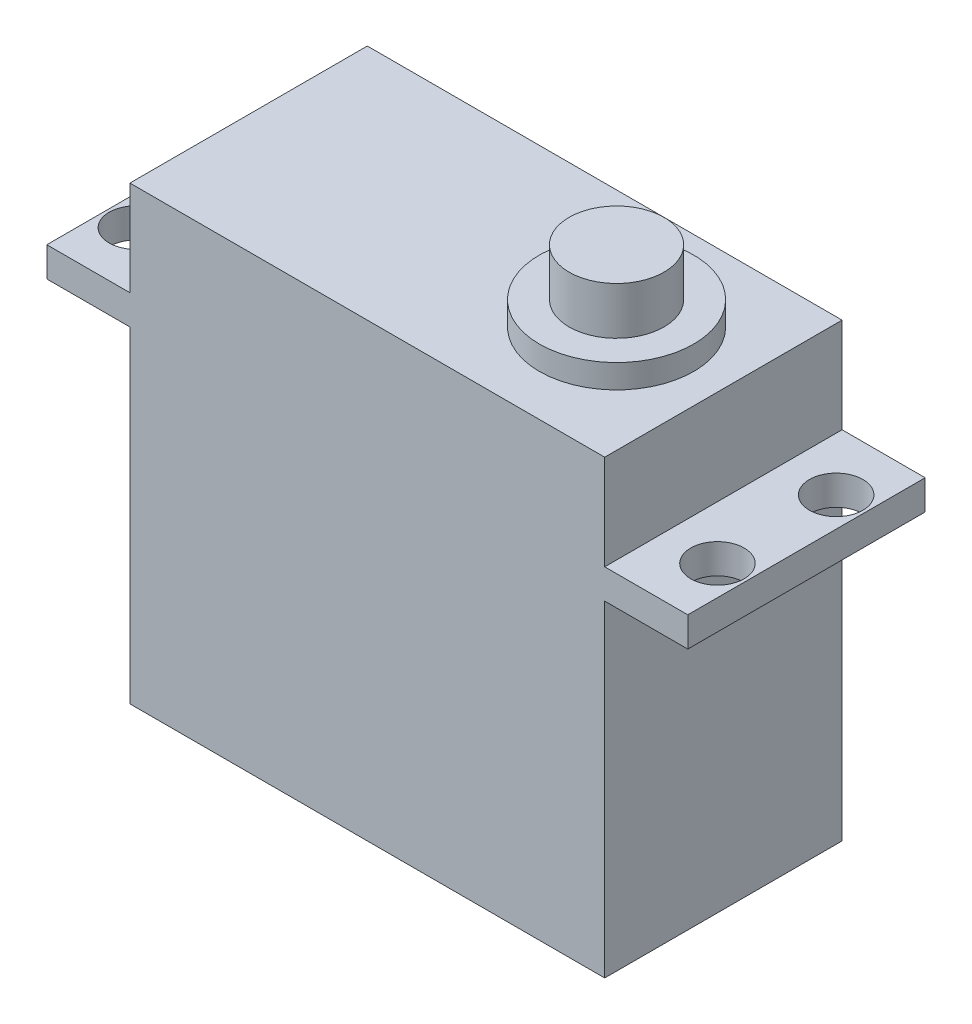
ISO-10303-21;
HEADER;
FILE_DESCRIPTION(('STEP AP214'),'2;1');
FILE_NAME('part.step','',(''),(''),'','','');
FILE_SCHEMA(('AUTOMOTIVE_DESIGN { 1 0 10303 214 1 1 1 1 }'));
ENDSEC;
DATA;
#1=APPLICATION_CONTEXT('core data for automotive mechanical design processes');
#2=APPLICATION_PROTOCOL_DEFINITION('international standard','automotive_design',2000,#1);
#3=PRODUCT_CONTEXT('',#1,'mechanical');
#4=PRODUCT('Part','Part','',(#3));
#5=PRODUCT_RELATED_PRODUCT_CATEGORY('part','',(#4));
#6=PRODUCT_DEFINITION_FORMATION('','',#4);
#7=PRODUCT_DEFINITION_CONTEXT('part definition',#1,'design');
#8=PRODUCT_DEFINITION('design','',#6,#7);
#9=PRODUCT_DEFINITION_SHAPE('','',#8);
#10=(LENGTH_UNIT() NAMED_UNIT(*) SI_UNIT(.MILLI.,.METRE.));
#11=(NAMED_UNIT(*) PLANE_ANGLE_UNIT() SI_UNIT($,.RADIAN.));
#12=(NAMED_UNIT(*) SI_UNIT($,.STERADIAN.) SOLID_ANGLE_UNIT());
#13=UNCERTAINTY_MEASURE_WITH_UNIT(LENGTH_MEASURE(1.E-05),#10,'distance_accuracy_value','');
#14=(GEOMETRIC_REPRESENTATION_CONTEXT(3) GLOBAL_UNCERTAINTY_ASSIGNED_CONTEXT((#13)) GLOBAL_UNIT_ASSIGNED_CONTEXT((#10,
#11,#12)) REPRESENTATION_CONTEXT('',''));
#15=CARTESIAN_POINT('',(0.,0.,0.));
#16=DIRECTION('',(0.,0.,1.));
#17=DIRECTION('',(1.,0.,0.));
#18=AXIS2_PLACEMENT_3D('',#15,#16,#17);
#19=CARTESIAN_POINT('',(-22.,-10.5,0.));
#20=DIRECTION('',(0.,1.,0.));
#21=DIRECTION('',(0.,0.,1.));
#22=AXIS2_PLACEMENT_3D('',#19,#20,#21);
#23=PLANE('',#22);
#24=DIRECTION('',(0.,0.,-1.));
#25=VECTOR('',#24,1.);
#26=CARTESIAN_POINT('',(-31.,-10.5,-10.));
#27=LINE('',#26,#25);
#28=CARTESIAN_POINT('',(-31.,-10.5,10.));
#29=VERTEX_POINT('',#28);
#30=CARTESIAN_POINT('',(-31.,-10.5,-9.99999999999999));
#31=VERTEX_POINT('',#30);
#32=EDGE_CURVE('E240',#29,#31,#27,.T.);
#33=ORIENTED_EDGE('',*,*,#32,.F.);
#34=DIRECTION('',(1.,0.,0.));
#35=VECTOR('',#34,1.);
#36=CARTESIAN_POINT('',(-31.,-10.5,10.));
#37=LINE('',#36,#35);
#38=CARTESIAN_POINT('',(-38.,-10.5,10.));
#39=VERTEX_POINT('',#38);
#40=EDGE_CURVE('E60',#39,#29,#37,.T.);
#41=ORIENTED_EDGE('',*,*,#40,.F.);
#42=DIRECTION('',(0.,0.,1.));
#43=VECTOR('',#42,1.);
#44=CARTESIAN_POINT('',(-38.,-10.5,-10.));
#45=LINE('',#44,#43);
#46=CARTESIAN_POINT('',(-38.,-10.5,-10.));
#47=VERTEX_POINT('',#46);
#48=EDGE_CURVE('E245',#47,#39,#45,.T.);
#49=ORIENTED_EDGE('',*,*,#48,.F.);
#50=DIRECTION('',(-1.,0.,0.));
#51=VECTOR('',#50,1.);
#52=CARTESIAN_POINT('',(-31.,-10.5,-10.));
#53=LINE('',#52,#51);
#54=EDGE_CURVE('E243',#31,#47,#53,.T.);
#55=ORIENTED_EDGE('',*,*,#54,.F.);
#56=EDGE_LOOP('',(#33,#41,#49,#55));
#57=FACE_BOUND('',#56,.T.);
#58=CARTESIAN_POINT('',(-35.5,-10.5,-5.));
#59=DIRECTION('',(0.,1.,0.));
#60=DIRECTION('',(0.,0.,-1.));
#61=AXIS2_PLACEMENT_3D('',#58,#59,#60);
#62=CIRCLE('',#61,2.25);
#63=CARTESIAN_POINT('',(-35.5,-10.5,-7.25));
#64=VERTEX_POINT('',#63);
#65=EDGE_CURVE('E234',#64,#64,#62,.T.);
#66=ORIENTED_EDGE('',*,*,#65,.T.);
#67=EDGE_LOOP('',(#66));
#68=FACE_BOUND('',#67,.T.);
#69=CARTESIAN_POINT('',(-35.5,-10.5,5.));
#70=DIRECTION('',(0.,1.,0.));
#71=DIRECTION('',(0.,0.,-1.));
#72=AXIS2_PLACEMENT_3D('',#69,#70,#71);
#73=CIRCLE('',#72,2.25);
#74=CARTESIAN_POINT('',(-35.5,-10.5,2.75));
#75=VERTEX_POINT('',#74);
#76=EDGE_CURVE('E228',#75,#75,#73,.T.);
#77=ORIENTED_EDGE('',*,*,#76,.T.);
#78=EDGE_LOOP('',(#77));
#79=FACE_BOUND('',#78,.T.);
#80=ADVANCED_FACE('F43',(#57,#68,#79),#23,.F.);
#81=CARTESIAN_POINT('',(-22.,-8.,0.));
#82=DIRECTION('',(0.,1.,0.));
#83=DIRECTION('',(0.,0.,1.));
#84=AXIS2_PLACEMENT_3D('',#81,#82,#83);
#85=PLANE('',#84);
#86=CARTESIAN_POINT('',(-35.5,-8.,-5.));
#87=DIRECTION('',(0.,1.,0.));
#88=DIRECTION('',(0.,0.,-1.));
#89=AXIS2_PLACEMENT_3D('',#86,#87,#88);
#90=CIRCLE('',#89,2.25);
#91=CARTESIAN_POINT('',(-35.5,-8.,-7.25));
#92=VERTEX_POINT('',#91);
#93=EDGE_CURVE('E231',#92,#92,#90,.T.);
#94=ORIENTED_EDGE('',*,*,#93,.F.);
#95=EDGE_LOOP('',(#94));
#96=FACE_BOUND('',#95,.T.);
#97=DIRECTION('',(0.,0.,-1.));
#98=VECTOR('',#97,1.);
#99=CARTESIAN_POINT('',(-31.,-8.,-10.));
#100=LINE('',#99,#98);
#101=CARTESIAN_POINT('',(-31.,-8.,10.));
#102=VERTEX_POINT('',#101);
#103=CARTESIAN_POINT('',(-31.,-8.,-10.));
#104=VERTEX_POINT('',#103);
#105=EDGE_CURVE('E237',#102,#104,#100,.T.);
#106=ORIENTED_EDGE('',*,*,#105,.T.);
#107=DIRECTION('',(-1.,0.,0.));
#108=VECTOR('',#107,1.);
#109=CARTESIAN_POINT('',(-31.,-8.,-10.));
#110=LINE('',#109,#108);
#111=CARTESIAN_POINT('',(-38.,-8.,-10.));
#112=VERTEX_POINT('',#111);
#113=EDGE_CURVE('E249',#104,#112,#110,.T.);
#114=ORIENTED_EDGE('',*,*,#113,.T.);
#115=DIRECTION('',(0.,0.,1.));
#116=VECTOR('',#115,1.);
#117=CARTESIAN_POINT('',(-38.,-8.,-10.));
#118=LINE('',#117,#116);
#119=CARTESIAN_POINT('',(-38.,-8.,10.));
#120=VERTEX_POINT('',#119);
#121=EDGE_CURVE('E252',#112,#120,#118,.T.);
#122=ORIENTED_EDGE('',*,*,#121,.T.);
#123=DIRECTION('',(1.,0.,0.));
#124=VECTOR('',#123,1.);
#125=CARTESIAN_POINT('',(-31.,-8.,10.));
#126=LINE('',#125,#124);
#127=EDGE_CURVE('E81',#120,#102,#126,.T.);
#128=ORIENTED_EDGE('',*,*,#127,.T.);
#129=EDGE_LOOP('',(#106,#114,#122,#128));
#130=FACE_BOUND('',#129,.T.);
#131=CARTESIAN_POINT('',(-35.5,-8.,5.));
#132=DIRECTION('',(0.,1.,0.));
#133=DIRECTION('',(0.,0.,-1.));
#134=AXIS2_PLACEMENT_3D('',#131,#132,#133);
#135=CIRCLE('',#134,2.25);
#136=CARTESIAN_POINT('',(-35.5,-8.,2.75));
#137=VERTEX_POINT('',#136);
#138=EDGE_CURVE('E148',#137,#137,#135,.T.);
#139=ORIENTED_EDGE('',*,*,#138,.F.);
#140=EDGE_LOOP('',(#139));
#141=FACE_BOUND('',#140,.T.);
#142=ADVANCED_FACE('F254',(#96,#130,#141),#85,.T.);
#143=CARTESIAN_POINT('',(-31.,-10.5,-10.));
#144=DIRECTION('',(0.,0.,1.));
#145=DIRECTION('',(-1.,0.,0.));
#146=AXIS2_PLACEMENT_3D('',#143,#144,#145);
#147=PLANE('',#146);
#148=ORIENTED_EDGE('',*,*,#113,.F.);
#149=DIRECTION('',(0.,1.,0.));
#150=VECTOR('',#149,1.);
#151=CARTESIAN_POINT('',(-31.,-38.,-9.99999999999999));
#152=LINE('',#151,#150);
#153=CARTESIAN_POINT('',(-31.,0.,-9.99999999999999));
#154=VERTEX_POINT('',#153);
#155=EDGE_CURVE('E205',#104,#154,#152,.T.);
#156=ORIENTED_EDGE('',*,*,#155,.T.);
#157=DIRECTION('',(-1.,0.,0.));
#158=VECTOR('',#157,1.);
#159=CARTESIAN_POINT('',(0.,0.,-10.));
#160=LINE('',#159,#158);
#161=CARTESIAN_POINT('',(9.,0.,-10.));
#162=VERTEX_POINT('',#161);
#163=EDGE_CURVE('E195',#162,#154,#160,.T.);
#164=ORIENTED_EDGE('',*,*,#163,.F.);
#165=DIRECTION('',(0.,1.,0.));
#166=VECTOR('',#165,1.);
#167=CARTESIAN_POINT('',(9.,-38.,-10.));
#168=LINE('',#167,#166);
#169=CARTESIAN_POINT('',(9.,-8.,-10.));
#170=VERTEX_POINT('',#169);
#171=EDGE_CURVE('E149',#170,#162,#168,.T.);
#172=ORIENTED_EDGE('',*,*,#171,.F.);
#173=DIRECTION('',(1.,0.,0.));
#174=VECTOR('',#173,1.);
#175=CARTESIAN_POINT('',(9.,-8.,-10.));
#176=LINE('',#175,#174);
#177=CARTESIAN_POINT('',(16.,-8.,-10.));
#178=VERTEX_POINT('',#177);
#179=EDGE_CURVE('E178',#170,#178,#176,.T.);
#180=ORIENTED_EDGE('',*,*,#179,.T.);
#181=DIRECTION('',(0.,1.,0.));
#182=VECTOR('',#181,1.);
#183=CARTESIAN_POINT('',(16.,-10.5,-10.));
#184=LINE('',#183,#182);
#185=CARTESIAN_POINT('',(16.,-10.5,-10.));
#186=VERTEX_POINT('',#185);
#187=EDGE_CURVE('E154',#186,#178,#184,.T.);
#188=ORIENTED_EDGE('',*,*,#187,.F.);
#189=DIRECTION('',(1.,0.,0.));
#190=VECTOR('',#189,1.);
#191=CARTESIAN_POINT('',(9.,-10.5,-10.));
#192=LINE('',#191,#190);
#193=CARTESIAN_POINT('',(9.,-10.5,-10.));
#194=VERTEX_POINT('',#193);
#195=EDGE_CURVE('E152',#194,#186,#192,.T.);
#196=ORIENTED_EDGE('',*,*,#195,.F.);
#197=CARTESIAN_POINT('',(9.,-38.,-10.));
#198=VERTEX_POINT('',#197);
#199=EDGE_CURVE('E137',#198,#194,#168,.T.);
#200=ORIENTED_EDGE('',*,*,#199,.F.);
#201=DIRECTION('',(-1.,0.,0.));
#202=VECTOR('',#201,1.);
#203=CARTESIAN_POINT('',(0.,-38.,-10.));
#204=LINE('',#203,#202);
#205=CARTESIAN_POINT('',(-31.,-38.,-9.99999999999999));
#206=VERTEX_POINT('',#205);
#207=EDGE_CURVE('E196',#198,#206,#204,.T.);
#208=ORIENTED_EDGE('',*,*,#207,.T.);
#209=EDGE_CURVE('E223',#206,#31,#152,.T.);
#210=ORIENTED_EDGE('',*,*,#209,.T.);
#211=ORIENTED_EDGE('',*,*,#54,.T.);
#212=DIRECTION('',(0.,1.,0.));
#213=VECTOR('',#212,1.);
#214=CARTESIAN_POINT('',(-38.,-10.5,-10.));
#215=LINE('',#214,#213);
#216=EDGE_CURVE('E11',#47,#112,#215,.T.);
#217=ORIENTED_EDGE('',*,*,#216,.T.);
#218=EDGE_LOOP('',(#148,#156,#164,#172,#180,#188,#196,#200,#208,#210,#211,#217));
#219=FACE_BOUND('',#218,.T.);
#220=ADVANCED_FACE('F45',(#219),#147,.F.);
#221=CARTESIAN_POINT('',(-38.,-10.5,-10.));
#222=DIRECTION('',(1.,0.,0.));
#223=DIRECTION('',(0.,0.,1.));
#224=AXIS2_PLACEMENT_3D('',#221,#222,#223);
#225=PLANE('',#224);
#226=ORIENTED_EDGE('',*,*,#121,.F.);
#227=ORIENTED_EDGE('',*,*,#216,.F.);
#228=ORIENTED_EDGE('',*,*,#48,.T.);
#229=DIRECTION('',(0.,1.,0.));
#230=VECTOR('',#229,1.);
#231=CARTESIAN_POINT('',(-38.,-10.5,10.));
#232=LINE('',#231,#230);
#233=EDGE_CURVE('E52',#39,#120,#232,.T.);
#234=ORIENTED_EDGE('',*,*,#233,.T.);
#235=EDGE_LOOP('',(#226,#227,#228,#234));
#236=FACE_BOUND('',#235,.T.);
#237=ADVANCED_FACE('F256',(#236),#225,.F.);
#238=CARTESIAN_POINT('',(-31.,-10.5,10.));
#239=DIRECTION('',(0.,0.,-1.));
#240=DIRECTION('',(1.,0.,0.));
#241=AXIS2_PLACEMENT_3D('',#238,#239,#240);
#242=PLANE('',#241);
#243=ORIENTED_EDGE('',*,*,#127,.F.);
#244=ORIENTED_EDGE('',*,*,#233,.F.);
#245=ORIENTED_EDGE('',*,*,#40,.T.);
#246=DIRECTION('',(0.,1.,0.));
#247=VECTOR('',#246,1.);
#248=CARTESIAN_POINT('',(-31.,-38.,9.99999999999999));
#249=LINE('',#248,#247);
#250=CARTESIAN_POINT('',(-31.,-38.,9.99999999999999));
#251=VERTEX_POINT('',#250);
#252=EDGE_CURVE('E219',#251,#29,#249,.T.);
#253=ORIENTED_EDGE('',*,*,#252,.F.);
#254=DIRECTION('',(-1.,0.,0.));
#255=VECTOR('',#254,1.);
#256=CARTESIAN_POINT('',(0.,-38.,10.));
#257=LINE('',#256,#255);
#258=CARTESIAN_POINT('',(9.,-38.,10.));
#259=VERTEX_POINT('',#258);
#260=EDGE_CURVE('E202',#259,#251,#257,.T.);
#261=ORIENTED_EDGE('',*,*,#260,.F.);
#262=DIRECTION('',(0.,1.,0.));
#263=VECTOR('',#262,1.);
#264=CARTESIAN_POINT('',(9.,-38.,10.));
#265=LINE('',#264,#263);
#266=CARTESIAN_POINT('',(9.,-10.5,10.));
#267=VERTEX_POINT('',#266);
#268=EDGE_CURVE('E216',#259,#267,#265,.T.);
#269=ORIENTED_EDGE('',*,*,#268,.T.);
#270=DIRECTION('',(-1.,0.,0.));
#271=VECTOR('',#270,1.);
#272=CARTESIAN_POINT('',(9.,-10.5,10.));
#273=LINE('',#272,#271);
#274=CARTESIAN_POINT('',(16.,-10.5,10.));
#275=VERTEX_POINT('',#274);
#276=EDGE_CURVE('E163',#275,#267,#273,.T.);
#277=ORIENTED_EDGE('',*,*,#276,.F.);
#278=DIRECTION('',(0.,1.,0.));
#279=VECTOR('',#278,1.);
#280=CARTESIAN_POINT('',(16.,-10.5,10.));
#281=LINE('',#280,#279);
#282=CARTESIAN_POINT('',(16.,-8.,10.));
#283=VERTEX_POINT('',#282);
#284=EDGE_CURVE('E175',#275,#283,#281,.T.);
#285=ORIENTED_EDGE('',*,*,#284,.T.);
#286=DIRECTION('',(-1.,0.,0.));
#287=VECTOR('',#286,1.);
#288=CARTESIAN_POINT('',(9.,-8.,10.));
#289=LINE('',#288,#287);
#290=CARTESIAN_POINT('',(9.,-8.,10.));
#291=VERTEX_POINT('',#290);
#292=EDGE_CURVE('E164',#283,#291,#289,.T.);
#293=ORIENTED_EDGE('',*,*,#292,.T.);
#294=CARTESIAN_POINT('',(9.,0.,10.));
#295=VERTEX_POINT('',#294);
#296=EDGE_CURVE('E218',#291,#295,#265,.T.);
#297=ORIENTED_EDGE('',*,*,#296,.T.);
#298=DIRECTION('',(-1.,0.,0.));
#299=VECTOR('',#298,1.);
#300=CARTESIAN_POINT('',(0.,0.,10.));
#301=LINE('',#300,#299);
#302=CARTESIAN_POINT('',(-31.,0.,9.99999999999999));
#303=VERTEX_POINT('',#302);
#304=EDGE_CURVE('E211',#295,#303,#301,.T.);
#305=ORIENTED_EDGE('',*,*,#304,.T.);
#306=EDGE_CURVE('E222',#102,#303,#249,.T.);
#307=ORIENTED_EDGE('',*,*,#306,.F.);
#308=EDGE_LOOP('',(#243,#244,#245,#253,#261,#269,#277,#285,#293,#297,#305,#307));
#309=FACE_BOUND('',#308,.T.);
#310=ADVANCED_FACE('F258',(#309),#242,.F.);
#311=CARTESIAN_POINT('',(-35.5,-10.5,-5.));
#312=DIRECTION('',(0.,1.,0.));
#313=DIRECTION('',(0.,0.,1.));
#314=AXIS2_PLACEMENT_3D('',#311,#312,#313);
#315=CYLINDRICAL_SURFACE('',#314,2.25);
#316=ORIENTED_EDGE('',*,*,#65,.F.);
#317=EDGE_LOOP('',(#316));
#318=FACE_BOUND('',#317,.T.);
#319=ORIENTED_EDGE('',*,*,#93,.T.);
#320=EDGE_LOOP('',(#319));
#321=FACE_BOUND('',#320,.T.);
#322=ADVANCED_FACE('F263',(#318,#321),#315,.F.);
#323=CARTESIAN_POINT('',(-35.5,-10.5,5.));
#324=DIRECTION('',(0.,1.,0.));
#325=DIRECTION('',(0.,0.,1.));
#326=AXIS2_PLACEMENT_3D('',#323,#324,#325);
#327=CYLINDRICAL_SURFACE('',#326,2.25);
#328=ORIENTED_EDGE('',*,*,#76,.F.);
#329=EDGE_LOOP('',(#328));
#330=FACE_BOUND('',#329,.T.);
#331=ORIENTED_EDGE('',*,*,#138,.T.);
#332=EDGE_LOOP('',(#331));
#333=FACE_BOUND('',#332,.T.);
#334=ADVANCED_FACE('F277',(#330,#333),#327,.F.);
#335=CARTESIAN_POINT('',(-31.,-38.,0.));
#336=DIRECTION('',(-1.,0.,0.));
#337=DIRECTION('',(0.,0.,1.));
#338=AXIS2_PLACEMENT_3D('',#335,#336,#337);
#339=PLANE('',#338);
#340=ORIENTED_EDGE('',*,*,#105,.F.);
#341=ORIENTED_EDGE('',*,*,#306,.T.);
#342=DIRECTION('',(0.,0.,1.));
#343=VECTOR('',#342,1.);
#344=CARTESIAN_POINT('',(-31.,0.,0.));
#345=LINE('',#344,#343);
#346=EDGE_CURVE('E208',#154,#303,#345,.T.);
#347=ORIENTED_EDGE('',*,*,#346,.F.);
#348=ORIENTED_EDGE('',*,*,#155,.F.);
#349=EDGE_LOOP('',(#340,#341,#347,#348));
#350=FACE_BOUND('',#349,.T.);
#351=ADVANCED_FACE('F281',(#350),#339,.T.);
#352=CARTESIAN_POINT('',(9.,-38.,0.));
#353=DIRECTION('',(-1.,0.,0.));
#354=DIRECTION('',(0.,0.,1.));
#355=AXIS2_PLACEMENT_3D('',#352,#353,#354);
#356=PLANE('',#355);
#357=DIRECTION('',(0.,0.,-1.));
#358=VECTOR('',#357,1.);
#359=CARTESIAN_POINT('',(9.,-10.5,-10.));
#360=LINE('',#359,#358);
#361=EDGE_CURVE('E142',#267,#194,#360,.T.);
#362=ORIENTED_EDGE('',*,*,#361,.F.);
#363=ORIENTED_EDGE('',*,*,#268,.F.);
#364=DIRECTION('',(0.,0.,1.));
#365=VECTOR('',#364,1.);
#366=CARTESIAN_POINT('',(9.,-38.,0.));
#367=LINE('',#366,#365);
#368=EDGE_CURVE('E144',#198,#259,#367,.T.);
#369=ORIENTED_EDGE('',*,*,#368,.F.);
#370=ORIENTED_EDGE('',*,*,#199,.T.);
#371=EDGE_LOOP('',(#362,#363,#369,#370));
#372=FACE_BOUND('',#371,.T.);
#373=ADVANCED_FACE('F139',(#372),#356,.F.);
#374=ORIENTED_EDGE('',*,*,#296,.F.);
#375=DIRECTION('',(0.,0.,-1.));
#376=VECTOR('',#375,1.);
#377=CARTESIAN_POINT('',(9.,-8.,-10.));
#378=LINE('',#377,#376);
#379=EDGE_CURVE('E176',#291,#170,#378,.T.);
#380=ORIENTED_EDGE('',*,*,#379,.T.);
#381=ORIENTED_EDGE('',*,*,#171,.T.);
#382=DIRECTION('',(0.,0.,1.));
#383=VECTOR('',#382,1.);
#384=CARTESIAN_POINT('',(9.,0.,0.));
#385=LINE('',#384,#383);
#386=EDGE_CURVE('E199',#162,#295,#385,.T.);
#387=ORIENTED_EDGE('',*,*,#386,.T.);
#388=EDGE_LOOP('',(#374,#380,#381,#387));
#389=FACE_BOUND('',#388,.T.);
#390=ADVANCED_FACE('F287',(#389),#356,.F.);
#391=ORIENTED_EDGE('',*,*,#252,.T.);
#392=ORIENTED_EDGE('',*,*,#32,.T.);
#393=ORIENTED_EDGE('',*,*,#209,.F.);
#394=DIRECTION('',(0.,0.,1.));
#395=VECTOR('',#394,1.);
#396=CARTESIAN_POINT('',(-31.,-38.,0.));
#397=LINE('',#396,#395);
#398=EDGE_CURVE('E198',#206,#251,#397,.T.);
#399=ORIENTED_EDGE('',*,*,#398,.T.);
#400=EDGE_LOOP('',(#391,#392,#393,#399));
#401=FACE_BOUND('',#400,.T.);
#402=ADVANCED_FACE('F283',(#401),#339,.T.);
#403=CARTESIAN_POINT('',(0.,-38.,0.));
#404=DIRECTION('',(0.,1.,0.));
#405=DIRECTION('',(0.,0.,1.));
#406=AXIS2_PLACEMENT_3D('',#403,#404,#405);
#407=PLANE('',#406);
#408=ORIENTED_EDGE('',*,*,#207,.F.);
#409=ORIENTED_EDGE('',*,*,#368,.T.);
#410=ORIENTED_EDGE('',*,*,#260,.T.);
#411=ORIENTED_EDGE('',*,*,#398,.F.);
#412=EDGE_LOOP('',(#408,#409,#410,#411));
#413=FACE_BOUND('',#412,.T.);
#414=ADVANCED_FACE('F286',(#413),#407,.F.);
#415=CARTESIAN_POINT('',(0.,0.,0.));
#416=DIRECTION('',(0.,1.,0.));
#417=DIRECTION('',(0.,0.,1.));
#418=AXIS2_PLACEMENT_3D('',#415,#416,#417);
#419=PLANE('',#418);
#420=CARTESIAN_POINT('',(0.,0.,0.));
#421=DIRECTION('',(0.,1.,0.));
#422=DIRECTION('',(0.,0.,1.));
#423=AXIS2_PLACEMENT_3D('',#420,#421,#422);
#424=CIRCLE('',#423,6.5);
#425=CARTESIAN_POINT('',(0.,0.,6.5));
#426=VERTEX_POINT('',#425);
#427=EDGE_CURVE('E185',#426,#426,#424,.T.);
#428=ORIENTED_EDGE('',*,*,#427,.F.);
#429=EDGE_LOOP('',(#428));
#430=FACE_BOUND('',#429,.T.);
#431=ORIENTED_EDGE('',*,*,#163,.T.);
#432=ORIENTED_EDGE('',*,*,#346,.T.);
#433=ORIENTED_EDGE('',*,*,#304,.F.);
#434=ORIENTED_EDGE('',*,*,#386,.F.);
#435=EDGE_LOOP('',(#431,#432,#433,#434));
#436=FACE_BOUND('',#435,.T.);
#437=ADVANCED_FACE('F292',(#430,#436),#419,.T.);
#438=CARTESIAN_POINT('',(0.,2.,0.));
#439=DIRECTION('',(0.,-1.,0.));
#440=DIRECTION('',(0.,0.,-1.));
#441=AXIS2_PLACEMENT_3D('',#438,#439,#440);
#442=CYLINDRICAL_SURFACE('',#441,6.5);
#443=CARTESIAN_POINT('',(0.,2.,0.));
#444=DIRECTION('',(0.,1.,0.));
#445=DIRECTION('',(0.,0.,1.));
#446=AXIS2_PLACEMENT_3D('',#443,#444,#445);
#447=CIRCLE('',#446,6.5);
#448=CARTESIAN_POINT('',(0.,2.,6.5));
#449=VERTEX_POINT('',#448);
#450=EDGE_CURVE('E186',#449,#449,#447,.T.);
#451=ORIENTED_EDGE('',*,*,#450,.F.);
#452=EDGE_LOOP('',(#451));
#453=FACE_BOUND('',#452,.T.);
#454=ORIENTED_EDGE('',*,*,#427,.T.);
#455=EDGE_LOOP('',(#454));
#456=FACE_BOUND('',#455,.T.);
#457=ADVANCED_FACE('F295',(#453,#456),#442,.T.);
#458=CARTESIAN_POINT('',(0.,2.,0.));
#459=DIRECTION('',(0.,1.,0.));
#460=DIRECTION('',(0.,0.,1.));
#461=AXIS2_PLACEMENT_3D('',#458,#459,#460);
#462=PLANE('',#461);
#463=CARTESIAN_POINT('',(0.,2.,0.));
#464=DIRECTION('',(0.,1.,0.));
#465=DIRECTION('',(0.,0.,1.));
#466=AXIS2_PLACEMENT_3D('',#463,#464,#465);
#467=CIRCLE('',#466,4.);
#468=CARTESIAN_POINT('',(0.,2.,4.));
#469=VERTEX_POINT('',#468);
#470=EDGE_CURVE('E189',#469,#469,#467,.T.);
#471=ORIENTED_EDGE('',*,*,#470,.F.);
#472=EDGE_LOOP('',(#471));
#473=FACE_BOUND('',#472,.T.);
#474=ORIENTED_EDGE('',*,*,#450,.T.);
#475=EDGE_LOOP('',(#474));
#476=FACE_BOUND('',#475,.T.);
#477=ADVANCED_FACE('F307',(#473,#476),#462,.T.);
#478=CARTESIAN_POINT('',(0.,6.,0.));
#479=DIRECTION('',(0.,1.,0.));
#480=DIRECTION('',(0.,0.,1.));
#481=AXIS2_PLACEMENT_3D('',#478,#479,#480);
#482=PLANE('',#481);
#483=CARTESIAN_POINT('',(0.,6.,0.));
#484=DIRECTION('',(0.,1.,0.));
#485=DIRECTION('',(0.,0.,1.));
#486=AXIS2_PLACEMENT_3D('',#483,#484,#485);
#487=CIRCLE('',#486,4.);
#488=CARTESIAN_POINT('',(0.,6.,4.));
#489=VERTEX_POINT('',#488);
#490=EDGE_CURVE('E192',#489,#489,#487,.T.);
#491=ORIENTED_EDGE('',*,*,#490,.T.);
#492=EDGE_LOOP('',(#491));
#493=FACE_BOUND('',#492,.T.);
#494=ADVANCED_FACE('F303',(#493),#482,.T.);
#495=CARTESIAN_POINT('',(0.,6.,0.));
#496=DIRECTION('',(0.,-1.,0.));
#497=DIRECTION('',(0.,0.,-1.));
#498=AXIS2_PLACEMENT_3D('',#495,#496,#497);
#499=CYLINDRICAL_SURFACE('',#498,4.);
#500=ORIENTED_EDGE('',*,*,#470,.T.);
#501=EDGE_LOOP('',(#500));
#502=FACE_BOUND('',#501,.T.);
#503=ORIENTED_EDGE('',*,*,#490,.F.);
#504=EDGE_LOOP('',(#503));
#505=FACE_BOUND('',#504,.T.);
#506=ADVANCED_FACE('F300',(#502,#505),#499,.T.);
#507=CARTESIAN_POINT('',(0.,-10.5,0.));
#508=DIRECTION('',(0.,1.,0.));
#509=DIRECTION('',(0.,0.,1.));
#510=AXIS2_PLACEMENT_3D('',#507,#508,#509);
#511=PLANE('',#510);
#512=ORIENTED_EDGE('',*,*,#361,.T.);
#513=ORIENTED_EDGE('',*,*,#195,.T.);
#514=DIRECTION('',(0.,0.,1.));
#515=VECTOR('',#514,1.);
#516=CARTESIAN_POINT('',(16.,-10.5,-10.));
#517=LINE('',#516,#515);
#518=EDGE_CURVE('E157',#186,#275,#517,.T.);
#519=ORIENTED_EDGE('',*,*,#518,.T.);
#520=ORIENTED_EDGE('',*,*,#276,.T.);
#521=EDGE_LOOP('',(#512,#513,#519,#520));
#522=FACE_BOUND('',#521,.T.);
#523=CARTESIAN_POINT('',(13.5,-10.5,-5.));
#524=DIRECTION('',(0.,-1.,0.));
#525=DIRECTION('',(0.,0.,-1.));
#526=AXIS2_PLACEMENT_3D('',#523,#524,#525);
#527=CIRCLE('',#526,2.25);
#528=CARTESIAN_POINT('',(13.5,-10.5,-7.25));
#529=VERTEX_POINT('',#528);
#530=EDGE_CURVE('E179',#529,#529,#527,.T.);
#531=ORIENTED_EDGE('',*,*,#530,.F.);
#532=EDGE_LOOP('',(#531));
#533=FACE_BOUND('',#532,.T.);
#534=CARTESIAN_POINT('',(13.5,-10.5,5.));
#535=DIRECTION('',(0.,-1.,0.));
#536=DIRECTION('',(0.,0.,-1.));
#537=AXIS2_PLACEMENT_3D('',#534,#535,#536);
#538=CIRCLE('',#537,2.25);
#539=CARTESIAN_POINT('',(13.5,-10.5,2.75));
#540=VERTEX_POINT('',#539);
#541=EDGE_CURVE('E337',#540,#540,#538,.T.);
#542=ORIENTED_EDGE('',*,*,#541,.F.);
#543=EDGE_LOOP('',(#542));
#544=FACE_BOUND('',#543,.T.);
#545=ADVANCED_FACE('F160',(#522,#533,#544),#511,.F.);
#546=CARTESIAN_POINT('',(0.,-8.,0.));
#547=DIRECTION('',(0.,1.,0.));
#548=DIRECTION('',(0.,0.,1.));
#549=AXIS2_PLACEMENT_3D('',#546,#547,#548);
#550=PLANE('',#549);
#551=CARTESIAN_POINT('',(13.5,-8.,-5.));
#552=DIRECTION('',(0.,-1.,0.));
#553=DIRECTION('',(0.,0.,-1.));
#554=AXIS2_PLACEMENT_3D('',#551,#552,#553);
#555=CIRCLE('',#554,2.25);
#556=CARTESIAN_POINT('',(13.5,-8.,-7.25));
#557=VERTEX_POINT('',#556);
#558=EDGE_CURVE('E170',#557,#557,#555,.T.);
#559=ORIENTED_EDGE('',*,*,#558,.T.);
#560=EDGE_LOOP('',(#559));
#561=FACE_BOUND('',#560,.T.);
#562=ORIENTED_EDGE('',*,*,#379,.F.);
#563=ORIENTED_EDGE('',*,*,#292,.F.);
#564=DIRECTION('',(0.,0.,1.));
#565=VECTOR('',#564,1.);
#566=CARTESIAN_POINT('',(16.,-8.,-10.));
#567=LINE('',#566,#565);
#568=EDGE_CURVE('E167',#178,#283,#567,.T.);
#569=ORIENTED_EDGE('',*,*,#568,.F.);
#570=ORIENTED_EDGE('',*,*,#179,.F.);
#571=EDGE_LOOP('',(#562,#563,#569,#570));
#572=FACE_BOUND('',#571,.T.);
#573=CARTESIAN_POINT('',(13.5,-8.,5.));
#574=DIRECTION('',(0.,-1.,0.));
#575=DIRECTION('',(0.,0.,-1.));
#576=AXIS2_PLACEMENT_3D('',#573,#574,#575);
#577=CIRCLE('',#576,2.25);
#578=CARTESIAN_POINT('',(13.5,-8.,2.75));
#579=VERTEX_POINT('',#578);
#580=EDGE_CURVE('E340',#579,#579,#577,.T.);
#581=ORIENTED_EDGE('',*,*,#580,.T.);
#582=EDGE_LOOP('',(#581));
#583=FACE_BOUND('',#582,.T.);
#584=ADVANCED_FACE('F319',(#561,#572,#583),#550,.T.);
#585=CARTESIAN_POINT('',(16.,-10.5,-10.));
#586=DIRECTION('',(-1.,0.,0.));
#587=DIRECTION('',(0.,0.,1.));
#588=AXIS2_PLACEMENT_3D('',#585,#586,#587);
#589=PLANE('',#588);
#590=ORIENTED_EDGE('',*,*,#568,.T.);
#591=ORIENTED_EDGE('',*,*,#284,.F.);
#592=ORIENTED_EDGE('',*,*,#518,.F.);
#593=ORIENTED_EDGE('',*,*,#187,.T.);
#594=EDGE_LOOP('',(#590,#591,#592,#593));
#595=FACE_BOUND('',#594,.T.);
#596=ADVANCED_FACE('F315',(#595),#589,.F.);
#597=CARTESIAN_POINT('',(13.5,-10.5,-5.));
#598=DIRECTION('',(0.,1.,0.));
#599=DIRECTION('',(0.,0.,1.));
#600=AXIS2_PLACEMENT_3D('',#597,#598,#599);
#601=CYLINDRICAL_SURFACE('',#600,2.25);
#602=ORIENTED_EDGE('',*,*,#530,.T.);
#603=EDGE_LOOP('',(#602));
#604=FACE_BOUND('',#603,.T.);
#605=ORIENTED_EDGE('',*,*,#558,.F.);
#606=EDGE_LOOP('',(#605));
#607=FACE_BOUND('',#606,.T.);
#608=ADVANCED_FACE('F318',(#604,#607),#601,.F.);
#609=CARTESIAN_POINT('',(13.5,-10.5,5.));
#610=DIRECTION('',(0.,1.,0.));
#611=DIRECTION('',(0.,0.,1.));
#612=AXIS2_PLACEMENT_3D('',#609,#610,#611);
#613=CYLINDRICAL_SURFACE('',#612,2.25);
#614=ORIENTED_EDGE('',*,*,#541,.T.);
#615=EDGE_LOOP('',(#614));
#616=FACE_BOUND('',#615,.T.);
#617=ORIENTED_EDGE('',*,*,#580,.F.);
#618=EDGE_LOOP('',(#617));
#619=FACE_BOUND('',#618,.T.);
#620=ADVANCED_FACE('F328',(#616,#619),#613,.F.);
#621=CLOSED_SHELL('',(#80,#142,#220,#237,#310,#322,#334,#351,#373,#390,#402,#414,#437,#457,#477,
#494,#506,#545,#584,#596,#608,#620));
#622=MANIFOLD_SOLID_BREP('B2',#621);
#623=ADVANCED_BREP_SHAPE_REPRESENTATION('',(#18,#622),#14);
#624=SHAPE_DEFINITION_REPRESENTATION(#9,#623);
ENDSEC;
END-ISO-10303-21;
